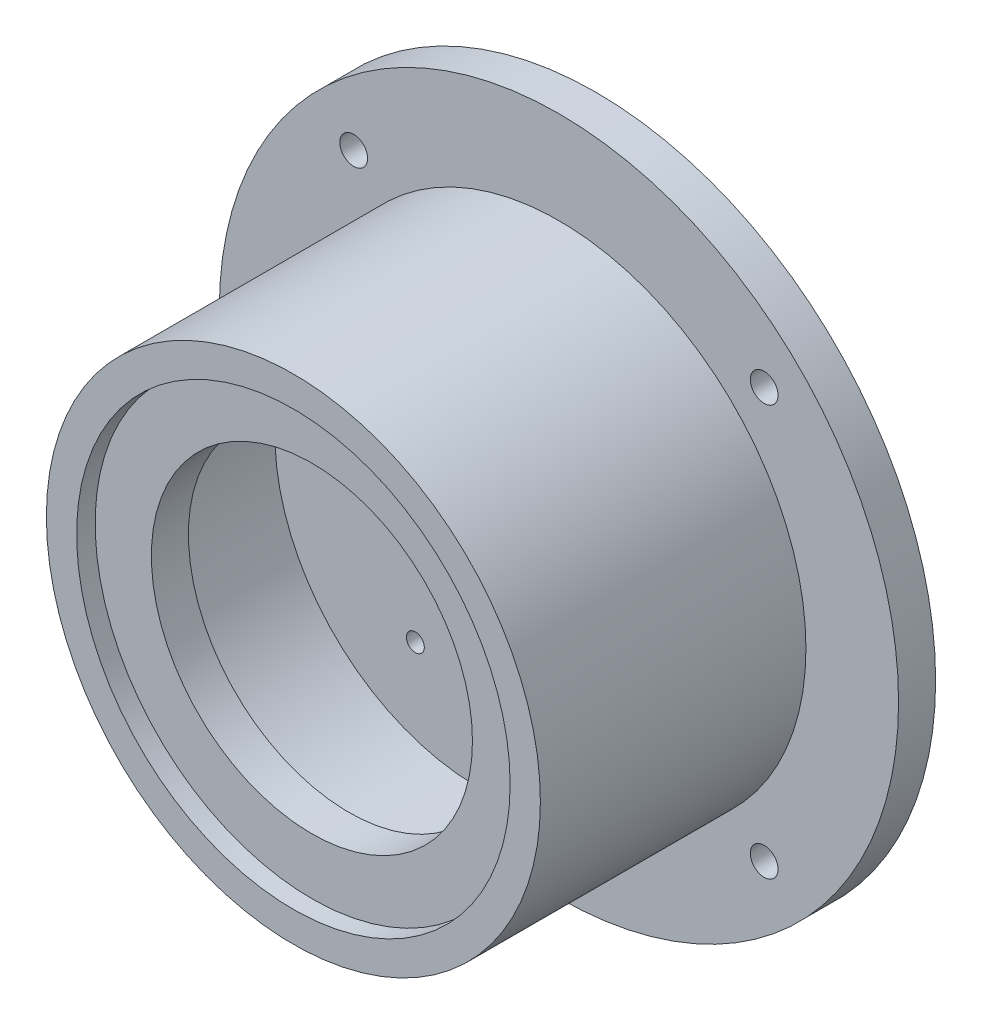
ISO-10303-21;
HEADER;
FILE_DESCRIPTION(('STEP AP214'),'2;1');
FILE_NAME('part.step','',(''),(''),'','','');
FILE_SCHEMA(('AUTOMOTIVE_DESIGN { 1 0 10303 214 1 1 1 1 }'));
ENDSEC;
DATA;
#1=APPLICATION_CONTEXT('core data for automotive mechanical design processes');
#2=APPLICATION_PROTOCOL_DEFINITION('international standard','automotive_design',2000,#1);
#3=PRODUCT_CONTEXT('',#1,'mechanical');
#4=PRODUCT('Part','Part','',(#3));
#5=PRODUCT_RELATED_PRODUCT_CATEGORY('part','',(#4));
#6=PRODUCT_DEFINITION_FORMATION('','',#4);
#7=PRODUCT_DEFINITION_CONTEXT('part definition',#1,'design');
#8=PRODUCT_DEFINITION('design','',#6,#7);
#9=PRODUCT_DEFINITION_SHAPE('','',#8);
#10=(LENGTH_UNIT() NAMED_UNIT(*) SI_UNIT(.MILLI.,.METRE.));
#11=(NAMED_UNIT(*) PLANE_ANGLE_UNIT() SI_UNIT($,.RADIAN.));
#12=(NAMED_UNIT(*) SI_UNIT($,.STERADIAN.) SOLID_ANGLE_UNIT());
#13=UNCERTAINTY_MEASURE_WITH_UNIT(LENGTH_MEASURE(1.E-05),#10,'distance_accuracy_value','');
#14=(GEOMETRIC_REPRESENTATION_CONTEXT(3) GLOBAL_UNCERTAINTY_ASSIGNED_CONTEXT((#13)) GLOBAL_UNIT_ASSIGNED_CONTEXT((#10,
#11,#12)) REPRESENTATION_CONTEXT('',''));
#15=CARTESIAN_POINT('',(0.,0.,0.));
#16=DIRECTION('',(0.,0.,1.));
#17=DIRECTION('',(1.,0.,0.));
#18=AXIS2_PLACEMENT_3D('',#15,#16,#17);
#19=CARTESIAN_POINT('',(0.,0.,16.));
#20=DIRECTION('',(0.,0.,1.));
#21=DIRECTION('',(1.,0.,0.));
#22=AXIS2_PLACEMENT_3D('',#19,#20,#21);
#23=PLANE('',#22);
#24=CARTESIAN_POINT('',(0.,0.,16.));
#25=DIRECTION('',(0.,0.,1.));
#26=DIRECTION('',(1.,0.,0.));
#27=AXIS2_PLACEMENT_3D('',#24,#25,#26);
#28=CIRCLE('',#27,28.);
#29=CARTESIAN_POINT('',(28.,0.,16.));
#30=VERTEX_POINT('',#29);
#31=EDGE_CURVE('E107',#30,#30,#28,.F.);
#32=ORIENTED_EDGE('',*,*,#31,.T.);
#33=EDGE_LOOP('',(#32));
#34=FACE_BOUND('',#33,.T.);
#35=CARTESIAN_POINT('',(0.,0.,16.));
#36=DIRECTION('',(0.,0.,1.));
#37=DIRECTION('',(1.,0.,0.));
#38=AXIS2_PLACEMENT_3D('',#35,#36,#37);
#39=CIRCLE('',#38,33.);
#40=CARTESIAN_POINT('',(33.,0.,16.));
#41=VERTEX_POINT('',#40);
#42=EDGE_CURVE('E67',#41,#41,#39,.T.);
#43=ORIENTED_EDGE('',*,*,#42,.T.);
#44=EDGE_LOOP('',(#43));
#45=FACE_BOUND('',#44,.T.);
#46=ADVANCED_FACE('F41',(#34,#45),#23,.T.);
#47=CARTESIAN_POINT('',(0.,0.,50.));
#48=DIRECTION('',(0.,0.,-1.));
#49=DIRECTION('',(-1.,0.,0.));
#50=AXIS2_PLACEMENT_3D('',#47,#48,#49);
#51=CYLINDRICAL_SURFACE('',#50,33.);
#52=ORIENTED_EDGE('',*,*,#42,.F.);
#53=EDGE_LOOP('',(#52));
#54=FACE_BOUND('',#53,.T.);
#55=CARTESIAN_POINT('',(0.,0.,23.));
#56=DIRECTION('',(0.,0.,1.));
#57=DIRECTION('',(1.,0.,0.));
#58=AXIS2_PLACEMENT_3D('',#55,#56,#57);
#59=CIRCLE('',#58,33.);
#60=CARTESIAN_POINT('',(33.,0.,23.));
#61=VERTEX_POINT('',#60);
#62=EDGE_CURVE('E105',#61,#61,#59,.T.);
#63=ORIENTED_EDGE('',*,*,#62,.T.);
#64=EDGE_LOOP('',(#63));
#65=FACE_BOUND('',#64,.T.);
#66=ADVANCED_FACE('F218',(#54,#65),#51,.F.);
#67=CARTESIAN_POINT('',(0.,0.,23.));
#68=DIRECTION('',(0.,0.,1.));
#69=DIRECTION('',(1.,0.,0.));
#70=AXIS2_PLACEMENT_3D('',#67,#68,#69);
#71=PLANE('',#70);
#72=CARTESIAN_POINT('',(20.5,0.,23.));
#73=DIRECTION('',(0.,0.,1.));
#74=DIRECTION('',(1.,0.,0.));
#75=AXIS2_PLACEMENT_3D('',#72,#73,#74);
#76=CIRCLE('',#75,1.45);
#77=CARTESIAN_POINT('',(21.95,0.,23.));
#78=VERTEX_POINT('',#77);
#79=EDGE_CURVE('E156',#78,#78,#76,.T.);
#80=ORIENTED_EDGE('',*,*,#79,.T.);
#81=EDGE_LOOP('',(#80));
#82=FACE_BOUND('',#81,.T.);
#83=CARTESIAN_POINT('',(10.25,-17.753520777581,23.));
#84=DIRECTION('',(0.,0.,1.));
#85=DIRECTION('',(1.,0.,0.));
#86=AXIS2_PLACEMENT_3D('',#83,#84,#85);
#87=CIRCLE('',#86,1.45);
#88=CARTESIAN_POINT('',(11.7,-17.753520777581,23.));
#89=VERTEX_POINT('',#88);
#90=EDGE_CURVE('E128',#89,#89,#87,.T.);
#91=ORIENTED_EDGE('',*,*,#90,.T.);
#92=EDGE_LOOP('',(#91));
#93=FACE_BOUND('',#92,.T.);
#94=CARTESIAN_POINT('',(-10.25,-17.753520777581,23.));
#95=DIRECTION('',(0.,0.,1.));
#96=DIRECTION('',(1.,0.,0.));
#97=AXIS2_PLACEMENT_3D('',#94,#95,#96);
#98=CIRCLE('',#97,1.45);
#99=CARTESIAN_POINT('',(-8.80000000000001,-17.753520777581,23.));
#100=VERTEX_POINT('',#99);
#101=EDGE_CURVE('E129',#100,#100,#98,.T.);
#102=ORIENTED_EDGE('',*,*,#101,.T.);
#103=EDGE_LOOP('',(#102));
#104=FACE_BOUND('',#103,.T.);
#105=CARTESIAN_POINT('',(-20.5,0.,23.));
#106=DIRECTION('',(0.,0.,1.));
#107=DIRECTION('',(1.,0.,0.));
#108=AXIS2_PLACEMENT_3D('',#105,#106,#107);
#109=CIRCLE('',#108,1.45);
#110=CARTESIAN_POINT('',(-19.05,0.,23.));
#111=VERTEX_POINT('',#110);
#112=EDGE_CURVE('E140',#111,#111,#109,.T.);
#113=ORIENTED_EDGE('',*,*,#112,.T.);
#114=EDGE_LOOP('',(#113));
#115=FACE_BOUND('',#114,.T.);
#116=CARTESIAN_POINT('',(-10.25,17.753520777581,23.));
#117=DIRECTION('',(0.,0.,1.));
#118=DIRECTION('',(1.,0.,0.));
#119=AXIS2_PLACEMENT_3D('',#116,#117,#118);
#120=CIRCLE('',#119,1.45);
#121=CARTESIAN_POINT('',(-8.8,17.753520777581,23.));
#122=VERTEX_POINT('',#121);
#123=EDGE_CURVE('E144',#122,#122,#120,.T.);
#124=ORIENTED_EDGE('',*,*,#123,.T.);
#125=EDGE_LOOP('',(#124));
#126=FACE_BOUND('',#125,.T.);
#127=CARTESIAN_POINT('',(10.25,17.753520777581,23.));
#128=DIRECTION('',(0.,0.,1.));
#129=DIRECTION('',(1.,0.,0.));
#130=AXIS2_PLACEMENT_3D('',#127,#128,#129);
#131=CIRCLE('',#130,1.45);
#132=CARTESIAN_POINT('',(11.7,17.753520777581,23.));
#133=VERTEX_POINT('',#132);
#134=EDGE_CURVE('E155',#133,#133,#131,.T.);
#135=ORIENTED_EDGE('',*,*,#134,.T.);
#136=EDGE_LOOP('',(#135));
#137=FACE_BOUND('',#136,.T.);
#138=CARTESIAN_POINT('',(0.,0.,23.));
#139=DIRECTION('',(0.,0.,1.));
#140=DIRECTION('',(1.,0.,0.));
#141=AXIS2_PLACEMENT_3D('',#138,#139,#140);
#142=CIRCLE('',#141,8.);
#143=CARTESIAN_POINT('',(8.,0.,23.));
#144=VERTEX_POINT('',#143);
#145=EDGE_CURVE('E120',#144,#144,#142,.T.);
#146=ORIENTED_EDGE('',*,*,#145,.T.);
#147=EDGE_LOOP('',(#146));
#148=FACE_BOUND('',#147,.T.);
#149=ORIENTED_EDGE('',*,*,#62,.F.);
#150=EDGE_LOOP('',(#149));
#151=FACE_BOUND('',#150,.T.);
#152=ADVANCED_FACE('F223',(#82,#93,#104,#115,#126,#137,#148,#151),#71,.F.);
#153=CARTESIAN_POINT('',(0.,0.,23.));
#154=DIRECTION('',(0.,0.,-1.));
#155=DIRECTION('',(-1.,0.,0.));
#156=AXIS2_PLACEMENT_3D('',#153,#154,#155);
#157=CYLINDRICAL_SURFACE('',#156,28.);
#158=ORIENTED_EDGE('',*,*,#31,.F.);
#159=EDGE_LOOP('',(#158));
#160=FACE_BOUND('',#159,.T.);
#161=CARTESIAN_POINT('',(0.,0.,10.));
#162=DIRECTION('',(0.,0.,1.));
#163=DIRECTION('',(1.,0.,0.));
#164=AXIS2_PLACEMENT_3D('',#161,#162,#163);
#165=CIRCLE('',#164,28.);
#166=CARTESIAN_POINT('',(28.,0.,10.));
#167=VERTEX_POINT('',#166);
#168=EDGE_CURVE('E115',#167,#167,#165,.T.);
#169=ORIENTED_EDGE('',*,*,#168,.F.);
#170=EDGE_LOOP('',(#169));
#171=FACE_BOUND('',#170,.T.);
#172=ADVANCED_FACE('F260',(#160,#171),#157,.F.);
#173=CARTESIAN_POINT('',(0.,0.,56.));
#174=DIRECTION('',(0.,0.,1.));
#175=DIRECTION('',(1.,0.,0.));
#176=AXIS2_PLACEMENT_3D('',#173,#174,#175);
#177=PLANE('',#176);
#178=CARTESIAN_POINT('',(0.,0.,56.));
#179=DIRECTION('',(0.,0.,1.));
#180=DIRECTION('',(1.,0.,0.));
#181=AXIS2_PLACEMENT_3D('',#178,#179,#180);
#182=CIRCLE('',#181,26.);
#183=CARTESIAN_POINT('',(26.,0.,56.));
#184=VERTEX_POINT('',#183);
#185=EDGE_CURVE('E84',#184,#184,#182,.T.);
#186=ORIENTED_EDGE('',*,*,#185,.F.);
#187=EDGE_LOOP('',(#186));
#188=FACE_BOUND('',#187,.T.);
#189=CARTESIAN_POINT('',(0.,0.,56.));
#190=DIRECTION('',(0.,0.,1.));
#191=DIRECTION('',(1.,0.,0.));
#192=AXIS2_PLACEMENT_3D('',#189,#190,#191);
#193=CIRCLE('',#192,35.1);
#194=CARTESIAN_POINT('',(35.1,0.,56.));
#195=VERTEX_POINT('',#194);
#196=EDGE_CURVE('E97',#195,#195,#193,.T.);
#197=ORIENTED_EDGE('',*,*,#196,.T.);
#198=EDGE_LOOP('',(#197));
#199=FACE_BOUND('',#198,.T.);
#200=ADVANCED_FACE('F259',(#188,#199),#177,.T.);
#201=CARTESIAN_POINT('',(0.,0.,50.));
#202=DIRECTION('',(0.,0.,1.));
#203=DIRECTION('',(1.,0.,0.));
#204=AXIS2_PLACEMENT_3D('',#201,#202,#203);
#205=PLANE('',#204);
#206=CARTESIAN_POINT('',(0.,0.,50.));
#207=DIRECTION('',(0.,0.,1.));
#208=DIRECTION('',(1.,0.,0.));
#209=AXIS2_PLACEMENT_3D('',#206,#207,#208);
#210=CIRCLE('',#209,26.);
#211=CARTESIAN_POINT('',(26.,0.,50.));
#212=VERTEX_POINT('',#211);
#213=EDGE_CURVE('E86',#212,#212,#210,.T.);
#214=ORIENTED_EDGE('',*,*,#213,.T.);
#215=EDGE_LOOP('',(#214));
#216=FACE_BOUND('',#215,.T.);
#217=CARTESIAN_POINT('',(0.,0.,50.));
#218=DIRECTION('',(0.,0.,1.));
#219=DIRECTION('',(1.,0.,0.));
#220=AXIS2_PLACEMENT_3D('',#217,#218,#219);
#221=CIRCLE('',#220,33.);
#222=CARTESIAN_POINT('',(33.,0.,50.));
#223=VERTEX_POINT('',#222);
#224=EDGE_CURVE('E78',#223,#223,#221,.T.);
#225=ORIENTED_EDGE('',*,*,#224,.F.);
#226=EDGE_LOOP('',(#225));
#227=FACE_BOUND('',#226,.T.);
#228=ADVANCED_FACE('F264',(#216,#227),#205,.F.);
#229=CARTESIAN_POINT('',(0.,0.,56.));
#230=DIRECTION('',(0.,0.,-1.));
#231=DIRECTION('',(-1.,0.,0.));
#232=AXIS2_PLACEMENT_3D('',#229,#230,#231);
#233=CYLINDRICAL_SURFACE('',#232,26.);
#234=ORIENTED_EDGE('',*,*,#185,.T.);
#235=EDGE_LOOP('',(#234));
#236=FACE_BOUND('',#235,.T.);
#237=ORIENTED_EDGE('',*,*,#213,.F.);
#238=EDGE_LOOP('',(#237));
#239=FACE_BOUND('',#238,.T.);
#240=ADVANCED_FACE('F284',(#236,#239),#233,.F.);
#241=CARTESIAN_POINT('',(0.,0.,29.));
#242=DIRECTION('',(0.,0.,1.));
#243=DIRECTION('',(1.,0.,0.));
#244=AXIS2_PLACEMENT_3D('',#241,#242,#243);
#245=CIRCLE('',#244,33.);
#246=CARTESIAN_POINT('',(33.,0.,29.));
#247=VERTEX_POINT('',#246);
#248=EDGE_CURVE('E10',#247,#247,#245,.T.);
#249=ORIENTED_EDGE('',*,*,#248,.F.);
#250=EDGE_LOOP('',(#249));
#251=FACE_BOUND('',#250,.T.);
#252=ORIENTED_EDGE('',*,*,#224,.T.);
#253=EDGE_LOOP('',(#252));
#254=FACE_BOUND('',#253,.T.);
#255=ADVANCED_FACE('F226',(#251,#254),#51,.F.);
#256=CARTESIAN_POINT('',(0.,0.,59.));
#257=DIRECTION('',(0.,0.,1.));
#258=DIRECTION('',(1.,0.,0.));
#259=AXIS2_PLACEMENT_3D('',#256,#257,#258);
#260=PLANE('',#259);
#261=CARTESIAN_POINT('',(0.,0.,59.));
#262=DIRECTION('',(0.,0.,1.));
#263=DIRECTION('',(1.,0.,0.));
#264=AXIS2_PLACEMENT_3D('',#261,#262,#263);
#265=CIRCLE('',#264,40.);
#266=CARTESIAN_POINT('',(40.,0.,59.));
#267=VERTEX_POINT('',#266);
#268=EDGE_CURVE('E91',#267,#267,#265,.T.);
#269=ORIENTED_EDGE('',*,*,#268,.T.);
#270=EDGE_LOOP('',(#269));
#271=FACE_BOUND('',#270,.T.);
#272=CARTESIAN_POINT('',(0.,0.,59.));
#273=DIRECTION('',(0.,0.,1.));
#274=DIRECTION('',(1.,0.,0.));
#275=AXIS2_PLACEMENT_3D('',#272,#273,#274);
#276=CIRCLE('',#275,35.1);
#277=CARTESIAN_POINT('',(35.1,0.,59.));
#278=VERTEX_POINT('',#277);
#279=EDGE_CURVE('E98',#278,#278,#276,.T.);
#280=ORIENTED_EDGE('',*,*,#279,.F.);
#281=EDGE_LOOP('',(#280));
#282=FACE_BOUND('',#281,.T.);
#283=ADVANCED_FACE('F278',(#271,#282),#260,.T.);
#284=CARTESIAN_POINT('',(0.,0.,59.));
#285=DIRECTION('',(0.,0.,-1.));
#286=DIRECTION('',(-1.,0.,0.));
#287=AXIS2_PLACEMENT_3D('',#284,#285,#286);
#288=CYLINDRICAL_SURFACE('',#287,35.1);
#289=ORIENTED_EDGE('',*,*,#279,.T.);
#290=EDGE_LOOP('',(#289));
#291=FACE_BOUND('',#290,.T.);
#292=ORIENTED_EDGE('',*,*,#196,.F.);
#293=EDGE_LOOP('',(#292));
#294=FACE_BOUND('',#293,.T.);
#295=ADVANCED_FACE('F252',(#291,#294),#288,.F.);
#296=CARTESIAN_POINT('',(0.,0.,10.));
#297=DIRECTION('',(0.,0.,1.));
#298=DIRECTION('',(1.,0.,0.));
#299=AXIS2_PLACEMENT_3D('',#296,#297,#298);
#300=PLANE('',#299);
#301=CARTESIAN_POINT('',(33.2340187157677,-33.2340187157677,10.));
#302=DIRECTION('',(0.,0.,1.));
#303=DIRECTION('',(1.,0.,0.));
#304=AXIS2_PLACEMENT_3D('',#301,#302,#303);
#305=CIRCLE('',#304,2.25);
#306=CARTESIAN_POINT('',(35.4840187157677,-33.2340187157677,10.));
#307=VERTEX_POINT('',#306);
#308=EDGE_CURVE('E182',#307,#307,#305,.T.);
#309=ORIENTED_EDGE('',*,*,#308,.T.);
#310=EDGE_LOOP('',(#309));
#311=FACE_BOUND('',#310,.T.);
#312=CARTESIAN_POINT('',(-33.2340187157677,-33.2340187157677,10.));
#313=DIRECTION('',(0.,0.,1.));
#314=DIRECTION('',(1.,0.,0.));
#315=AXIS2_PLACEMENT_3D('',#312,#313,#314);
#316=CIRCLE('',#315,2.25);
#317=CARTESIAN_POINT('',(-30.9840187157677,-33.2340187157677,10.));
#318=VERTEX_POINT('',#317);
#319=EDGE_CURVE('E187',#318,#318,#316,.T.);
#320=ORIENTED_EDGE('',*,*,#319,.T.);
#321=EDGE_LOOP('',(#320));
#322=FACE_BOUND('',#321,.T.);
#323=CARTESIAN_POINT('',(-33.2340187157677,33.2340187157677,10.));
#324=DIRECTION('',(0.,0.,1.));
#325=DIRECTION('',(1.,0.,0.));
#326=AXIS2_PLACEMENT_3D('',#323,#324,#325);
#327=CIRCLE('',#326,2.25);
#328=CARTESIAN_POINT('',(-30.9840187157677,33.2340187157677,10.));
#329=VERTEX_POINT('',#328);
#330=EDGE_CURVE('E172',#329,#329,#327,.T.);
#331=ORIENTED_EDGE('',*,*,#330,.T.);
#332=EDGE_LOOP('',(#331));
#333=FACE_BOUND('',#332,.T.);
#334=CARTESIAN_POINT('',(33.2340187157677,33.2340187157677,10.));
#335=DIRECTION('',(0.,0.,1.));
#336=DIRECTION('',(1.,0.,0.));
#337=AXIS2_PLACEMENT_3D('',#334,#335,#336);
#338=CIRCLE('',#337,2.25);
#339=CARTESIAN_POINT('',(35.4840187157677,33.2340187157677,10.));
#340=VERTEX_POINT('',#339);
#341=EDGE_CURVE('E173',#340,#340,#338,.T.);
#342=ORIENTED_EDGE('',*,*,#341,.T.);
#343=EDGE_LOOP('',(#342));
#344=FACE_BOUND('',#343,.T.);
#345=ORIENTED_EDGE('',*,*,#168,.T.);
#346=EDGE_LOOP('',(#345));
#347=FACE_BOUND('',#346,.T.);
#348=CARTESIAN_POINT('',(0.,0.,10.));
#349=DIRECTION('',(0.,0.,1.));
#350=DIRECTION('',(1.,0.,0.));
#351=AXIS2_PLACEMENT_3D('',#348,#349,#350);
#352=CIRCLE('',#351,55.);
#353=CARTESIAN_POINT('',(55.,0.,10.));
#354=VERTEX_POINT('',#353);
#355=EDGE_CURVE('E61',#354,#354,#352,.T.);
#356=ORIENTED_EDGE('',*,*,#355,.F.);
#357=EDGE_LOOP('',(#356));
#358=FACE_BOUND('',#357,.T.);
#359=ADVANCED_FACE('F199',(#311,#322,#333,#344,#347,#358),#300,.F.);
#360=CARTESIAN_POINT('',(0.,0.,16.));
#361=DIRECTION('',(0.,0.,-1.));
#362=DIRECTION('',(-1.,0.,0.));
#363=AXIS2_PLACEMENT_3D('',#360,#361,#362);
#364=CYLINDRICAL_SURFACE('',#363,55.);
#365=CARTESIAN_POINT('',(0.,0.,16.));
#366=DIRECTION('',(0.,0.,1.));
#367=DIRECTION('',(1.,0.,0.));
#368=AXIS2_PLACEMENT_3D('',#365,#366,#367);
#369=CIRCLE('',#368,55.);
#370=CARTESIAN_POINT('',(55.,0.,16.));
#371=VERTEX_POINT('',#370);
#372=EDGE_CURVE('E57',#371,#371,#369,.T.);
#373=ORIENTED_EDGE('',*,*,#372,.F.);
#374=EDGE_LOOP('',(#373));
#375=FACE_BOUND('',#374,.T.);
#376=ORIENTED_EDGE('',*,*,#355,.T.);
#377=EDGE_LOOP('',(#376));
#378=FACE_BOUND('',#377,.T.);
#379=ADVANCED_FACE('F43',(#375,#378),#364,.T.);
#380=CARTESIAN_POINT('',(33.2340187157677,-33.2340187157677,16.));
#381=DIRECTION('',(0.,0.,1.));
#382=DIRECTION('',(1.,0.,0.));
#383=AXIS2_PLACEMENT_3D('',#380,#381,#382);
#384=CIRCLE('',#383,2.25);
#385=CARTESIAN_POINT('',(35.4840187157677,-33.2340187157677,16.));
#386=VERTEX_POINT('',#385);
#387=EDGE_CURVE('E179',#386,#386,#384,.T.);
#388=ORIENTED_EDGE('',*,*,#387,.F.);
#389=EDGE_LOOP('',(#388));
#390=FACE_BOUND('',#389,.T.);
#391=CARTESIAN_POINT('',(-33.2340187157677,-33.2340187157677,16.));
#392=DIRECTION('',(0.,0.,1.));
#393=DIRECTION('',(1.,0.,0.));
#394=AXIS2_PLACEMENT_3D('',#391,#392,#393);
#395=CIRCLE('',#394,2.25);
#396=CARTESIAN_POINT('',(-30.9840187157677,-33.2340187157677,16.));
#397=VERTEX_POINT('',#396);
#398=EDGE_CURVE('E183',#397,#397,#395,.T.);
#399=ORIENTED_EDGE('',*,*,#398,.F.);
#400=EDGE_LOOP('',(#399));
#401=FACE_BOUND('',#400,.T.);
#402=CARTESIAN_POINT('',(-33.2340187157677,33.2340187157677,16.));
#403=DIRECTION('',(0.,0.,1.));
#404=DIRECTION('',(1.,0.,0.));
#405=AXIS2_PLACEMENT_3D('',#402,#403,#404);
#406=CIRCLE('',#405,2.25);
#407=CARTESIAN_POINT('',(-30.9840187157677,33.2340187157677,16.));
#408=VERTEX_POINT('',#407);
#409=EDGE_CURVE('E195',#408,#408,#406,.T.);
#410=ORIENTED_EDGE('',*,*,#409,.F.);
#411=EDGE_LOOP('',(#410));
#412=FACE_BOUND('',#411,.T.);
#413=CARTESIAN_POINT('',(33.2340187157677,33.2340187157677,16.));
#414=DIRECTION('',(0.,0.,1.));
#415=DIRECTION('',(1.,0.,0.));
#416=AXIS2_PLACEMENT_3D('',#413,#414,#415);
#417=CIRCLE('',#416,2.25);
#418=CARTESIAN_POINT('',(35.4840187157677,33.2340187157677,16.));
#419=VERTEX_POINT('',#418);
#420=EDGE_CURVE('E161',#419,#419,#417,.T.);
#421=ORIENTED_EDGE('',*,*,#420,.F.);
#422=EDGE_LOOP('',(#421));
#423=FACE_BOUND('',#422,.T.);
#424=CARTESIAN_POINT('',(0.,0.,16.));
#425=DIRECTION('',(0.,0.,1.));
#426=DIRECTION('',(1.,0.,0.));
#427=AXIS2_PLACEMENT_3D('',#424,#425,#426);
#428=CIRCLE('',#427,40.);
#429=CARTESIAN_POINT('',(40.,0.,16.));
#430=VERTEX_POINT('',#429);
#431=EDGE_CURVE('E47',#430,#430,#428,.T.);
#432=ORIENTED_EDGE('',*,*,#431,.F.);
#433=EDGE_LOOP('',(#432));
#434=FACE_BOUND('',#433,.T.);
#435=ORIENTED_EDGE('',*,*,#372,.T.);
#436=EDGE_LOOP('',(#435));
#437=FACE_BOUND('',#436,.T.);
#438=ADVANCED_FACE('F225',(#390,#401,#412,#423,#434,#437),#23,.T.);
#439=CARTESIAN_POINT('',(0.,0.,50.));
#440=DIRECTION('',(0.,0.,-1.));
#441=DIRECTION('',(-1.,0.,0.));
#442=AXIS2_PLACEMENT_3D('',#439,#440,#441);
#443=CYLINDRICAL_SURFACE('',#442,40.);
#444=ORIENTED_EDGE('',*,*,#431,.T.);
#445=EDGE_LOOP('',(#444));
#446=FACE_BOUND('',#445,.T.);
#447=ORIENTED_EDGE('',*,*,#268,.F.);
#448=EDGE_LOOP('',(#447));
#449=FACE_BOUND('',#448,.T.);
#450=ADVANCED_FACE('F232',(#446,#449),#443,.T.);
#451=CARTESIAN_POINT('',(0.,0.,29.));
#452=DIRECTION('',(0.,0.,1.));
#453=DIRECTION('',(1.,0.,0.));
#454=AXIS2_PLACEMENT_3D('',#451,#452,#453);
#455=PLANE('',#454);
#456=CARTESIAN_POINT('',(20.5,0.,29.));
#457=DIRECTION('',(0.,0.,1.));
#458=DIRECTION('',(1.,0.,0.));
#459=AXIS2_PLACEMENT_3D('',#456,#457,#458);
#460=CIRCLE('',#459,1.45);
#461=CARTESIAN_POINT('',(21.95,0.,29.));
#462=VERTEX_POINT('',#461);
#463=EDGE_CURVE('E122',#462,#462,#460,.T.);
#464=ORIENTED_EDGE('',*,*,#463,.F.);
#465=EDGE_LOOP('',(#464));
#466=FACE_BOUND('',#465,.T.);
#467=CARTESIAN_POINT('',(10.25,-17.753520777581,29.));
#468=DIRECTION('',(0.,0.,1.));
#469=DIRECTION('',(1.,0.,0.));
#470=AXIS2_PLACEMENT_3D('',#467,#468,#469);
#471=CIRCLE('',#470,1.45);
#472=CARTESIAN_POINT('',(11.7,-17.753520777581,29.));
#473=VERTEX_POINT('',#472);
#474=EDGE_CURVE('E160',#473,#473,#471,.T.);
#475=ORIENTED_EDGE('',*,*,#474,.F.);
#476=EDGE_LOOP('',(#475));
#477=FACE_BOUND('',#476,.T.);
#478=CARTESIAN_POINT('',(-10.25,-17.753520777581,29.));
#479=DIRECTION('',(0.,0.,1.));
#480=DIRECTION('',(1.,0.,0.));
#481=AXIS2_PLACEMENT_3D('',#478,#479,#480);
#482=CIRCLE('',#481,1.45);
#483=CARTESIAN_POINT('',(-8.80000000000001,-17.753520777581,29.));
#484=VERTEX_POINT('',#483);
#485=EDGE_CURVE('E123',#484,#484,#482,.T.);
#486=ORIENTED_EDGE('',*,*,#485,.F.);
#487=EDGE_LOOP('',(#486));
#488=FACE_BOUND('',#487,.T.);
#489=CARTESIAN_POINT('',(-20.5,0.,29.));
#490=DIRECTION('',(0.,0.,1.));
#491=DIRECTION('',(1.,0.,0.));
#492=AXIS2_PLACEMENT_3D('',#489,#490,#491);
#493=CIRCLE('',#492,1.45);
#494=CARTESIAN_POINT('',(-19.05,0.,29.));
#495=VERTEX_POINT('',#494);
#496=EDGE_CURVE('E132',#495,#495,#493,.T.);
#497=ORIENTED_EDGE('',*,*,#496,.F.);
#498=EDGE_LOOP('',(#497));
#499=FACE_BOUND('',#498,.T.);
#500=CARTESIAN_POINT('',(-10.25,17.753520777581,29.));
#501=DIRECTION('',(0.,0.,1.));
#502=DIRECTION('',(1.,0.,0.));
#503=AXIS2_PLACEMENT_3D('',#500,#501,#502);
#504=CIRCLE('',#503,1.45);
#505=CARTESIAN_POINT('',(-8.8,17.753520777581,29.));
#506=VERTEX_POINT('',#505);
#507=EDGE_CURVE('E143',#506,#506,#504,.T.);
#508=ORIENTED_EDGE('',*,*,#507,.F.);
#509=EDGE_LOOP('',(#508));
#510=FACE_BOUND('',#509,.T.);
#511=CARTESIAN_POINT('',(10.25,17.753520777581,29.));
#512=DIRECTION('',(0.,0.,1.));
#513=DIRECTION('',(1.,0.,0.));
#514=AXIS2_PLACEMENT_3D('',#511,#512,#513);
#515=CIRCLE('',#514,1.45);
#516=CARTESIAN_POINT('',(11.7,17.753520777581,29.));
#517=VERTEX_POINT('',#516);
#518=EDGE_CURVE('E149',#517,#517,#515,.T.);
#519=ORIENTED_EDGE('',*,*,#518,.F.);
#520=EDGE_LOOP('',(#519));
#521=FACE_BOUND('',#520,.T.);
#522=CARTESIAN_POINT('',(0.,0.,29.));
#523=DIRECTION('',(0.,0.,1.));
#524=DIRECTION('',(1.,0.,0.));
#525=AXIS2_PLACEMENT_3D('',#522,#523,#524);
#526=CIRCLE('',#525,8.);
#527=CARTESIAN_POINT('',(8.,0.,29.));
#528=VERTEX_POINT('',#527);
#529=EDGE_CURVE('E118',#528,#528,#526,.T.);
#530=ORIENTED_EDGE('',*,*,#529,.F.);
#531=EDGE_LOOP('',(#530));
#532=FACE_BOUND('',#531,.T.);
#533=ORIENTED_EDGE('',*,*,#248,.T.);
#534=EDGE_LOOP('',(#533));
#535=FACE_BOUND('',#534,.T.);
#536=ADVANCED_FACE('F237',(#466,#477,#488,#499,#510,#521,#532,#535),#455,.T.);
#537=CARTESIAN_POINT('',(0.,0.,29.));
#538=DIRECTION('',(0.,0.,-1.));
#539=DIRECTION('',(-1.,0.,0.));
#540=AXIS2_PLACEMENT_3D('',#537,#538,#539);
#541=CYLINDRICAL_SURFACE('',#540,8.);
#542=ORIENTED_EDGE('',*,*,#529,.T.);
#543=EDGE_LOOP('',(#542));
#544=FACE_BOUND('',#543,.T.);
#545=ORIENTED_EDGE('',*,*,#145,.F.);
#546=EDGE_LOOP('',(#545));
#547=FACE_BOUND('',#546,.T.);
#548=ADVANCED_FACE('F272',(#544,#547),#541,.F.);
#549=CARTESIAN_POINT('',(10.25,17.753520777581,29.));
#550=DIRECTION('',(0.,0.,-1.));
#551=DIRECTION('',(-1.,0.,0.));
#552=AXIS2_PLACEMENT_3D('',#549,#550,#551);
#553=CYLINDRICAL_SURFACE('',#552,1.45);
#554=ORIENTED_EDGE('',*,*,#518,.T.);
#555=EDGE_LOOP('',(#554));
#556=FACE_BOUND('',#555,.T.);
#557=ORIENTED_EDGE('',*,*,#134,.F.);
#558=EDGE_LOOP('',(#557));
#559=FACE_BOUND('',#558,.T.);
#560=ADVANCED_FACE('F373',(#556,#559),#553,.F.);
#561=CARTESIAN_POINT('',(-10.25,17.753520777581,29.));
#562=DIRECTION('',(0.,0.,-1.));
#563=DIRECTION('',(-1.,0.,0.));
#564=AXIS2_PLACEMENT_3D('',#561,#562,#563);
#565=CYLINDRICAL_SURFACE('',#564,1.45);
#566=ORIENTED_EDGE('',*,*,#507,.T.);
#567=EDGE_LOOP('',(#566));
#568=FACE_BOUND('',#567,.T.);
#569=ORIENTED_EDGE('',*,*,#123,.F.);
#570=EDGE_LOOP('',(#569));
#571=FACE_BOUND('',#570,.T.);
#572=ADVANCED_FACE('F385',(#568,#571),#565,.F.);
#573=CARTESIAN_POINT('',(-20.5,0.,29.));
#574=DIRECTION('',(0.,0.,-1.));
#575=DIRECTION('',(-1.,0.,0.));
#576=AXIS2_PLACEMENT_3D('',#573,#574,#575);
#577=CYLINDRICAL_SURFACE('',#576,1.45);
#578=ORIENTED_EDGE('',*,*,#496,.T.);
#579=EDGE_LOOP('',(#578));
#580=FACE_BOUND('',#579,.T.);
#581=ORIENTED_EDGE('',*,*,#112,.F.);
#582=EDGE_LOOP('',(#581));
#583=FACE_BOUND('',#582,.T.);
#584=ADVANCED_FACE('F395',(#580,#583),#577,.F.);
#585=CARTESIAN_POINT('',(-10.25,-17.753520777581,29.));
#586=DIRECTION('',(0.,0.,-1.));
#587=DIRECTION('',(-1.,0.,0.));
#588=AXIS2_PLACEMENT_3D('',#585,#586,#587);
#589=CYLINDRICAL_SURFACE('',#588,1.45);
#590=ORIENTED_EDGE('',*,*,#485,.T.);
#591=EDGE_LOOP('',(#590));
#592=FACE_BOUND('',#591,.T.);
#593=ORIENTED_EDGE('',*,*,#101,.F.);
#594=EDGE_LOOP('',(#593));
#595=FACE_BOUND('',#594,.T.);
#596=ADVANCED_FACE('F405',(#592,#595),#589,.F.);
#597=CARTESIAN_POINT('',(10.25,-17.753520777581,29.));
#598=DIRECTION('',(0.,0.,-1.));
#599=DIRECTION('',(-1.,0.,0.));
#600=AXIS2_PLACEMENT_3D('',#597,#598,#599);
#601=CYLINDRICAL_SURFACE('',#600,1.45);
#602=ORIENTED_EDGE('',*,*,#474,.T.);
#603=EDGE_LOOP('',(#602));
#604=FACE_BOUND('',#603,.T.);
#605=ORIENTED_EDGE('',*,*,#90,.F.);
#606=EDGE_LOOP('',(#605));
#607=FACE_BOUND('',#606,.T.);
#608=ADVANCED_FACE('F414',(#604,#607),#601,.F.);
#609=CARTESIAN_POINT('',(20.5,0.,29.));
#610=DIRECTION('',(0.,0.,-1.));
#611=DIRECTION('',(-1.,0.,0.));
#612=AXIS2_PLACEMENT_3D('',#609,#610,#611);
#613=CYLINDRICAL_SURFACE('',#612,1.45);
#614=ORIENTED_EDGE('',*,*,#463,.T.);
#615=EDGE_LOOP('',(#614));
#616=FACE_BOUND('',#615,.T.);
#617=ORIENTED_EDGE('',*,*,#79,.F.);
#618=EDGE_LOOP('',(#617));
#619=FACE_BOUND('',#618,.T.);
#620=ADVANCED_FACE('F214',(#616,#619),#613,.F.);
#621=CARTESIAN_POINT('',(33.2340187157677,33.2340187157677,16.));
#622=DIRECTION('',(0.,0.,-1.));
#623=DIRECTION('',(-1.,0.,0.));
#624=AXIS2_PLACEMENT_3D('',#621,#622,#623);
#625=CYLINDRICAL_SURFACE('',#624,2.25);
#626=ORIENTED_EDGE('',*,*,#420,.T.);
#627=EDGE_LOOP('',(#626));
#628=FACE_BOUND('',#627,.T.);
#629=ORIENTED_EDGE('',*,*,#341,.F.);
#630=EDGE_LOOP('',(#629));
#631=FACE_BOUND('',#630,.T.);
#632=ADVANCED_FACE('F206',(#628,#631),#625,.F.);
#633=CARTESIAN_POINT('',(-33.2340187157677,33.2340187157677,16.));
#634=DIRECTION('',(0.,0.,-1.));
#635=DIRECTION('',(-1.,0.,0.));
#636=AXIS2_PLACEMENT_3D('',#633,#634,#635);
#637=CYLINDRICAL_SURFACE('',#636,2.25);
#638=ORIENTED_EDGE('',*,*,#409,.T.);
#639=EDGE_LOOP('',(#638));
#640=FACE_BOUND('',#639,.T.);
#641=ORIENTED_EDGE('',*,*,#330,.F.);
#642=EDGE_LOOP('',(#641));
#643=FACE_BOUND('',#642,.T.);
#644=ADVANCED_FACE('F201',(#640,#643),#637,.F.);
#645=CARTESIAN_POINT('',(-33.2340187157677,-33.2340187157677,16.));
#646=DIRECTION('',(0.,0.,-1.));
#647=DIRECTION('',(-1.,0.,0.));
#648=AXIS2_PLACEMENT_3D('',#645,#646,#647);
#649=CYLINDRICAL_SURFACE('',#648,2.25);
#650=ORIENTED_EDGE('',*,*,#398,.T.);
#651=EDGE_LOOP('',(#650));
#652=FACE_BOUND('',#651,.T.);
#653=ORIENTED_EDGE('',*,*,#319,.F.);
#654=EDGE_LOOP('',(#653));
#655=FACE_BOUND('',#654,.T.);
#656=ADVANCED_FACE('F202',(#652,#655),#649,.F.);
#657=CARTESIAN_POINT('',(33.2340187157677,-33.2340187157677,16.));
#658=DIRECTION('',(0.,0.,-1.));
#659=DIRECTION('',(-1.,0.,0.));
#660=AXIS2_PLACEMENT_3D('',#657,#658,#659);
#661=CYLINDRICAL_SURFACE('',#660,2.25);
#662=ORIENTED_EDGE('',*,*,#387,.T.);
#663=EDGE_LOOP('',(#662));
#664=FACE_BOUND('',#663,.T.);
#665=ORIENTED_EDGE('',*,*,#308,.F.);
#666=EDGE_LOOP('',(#665));
#667=FACE_BOUND('',#666,.T.);
#668=ADVANCED_FACE('F215',(#664,#667),#661,.F.);
#669=CLOSED_SHELL('',(#46,#66,#152,#172,#200,#228,#240,#255,#283,#295,#359,#379,#438,#450,#536,
#548,#560,#572,#584,#596,#608,#620,#632,#644,#656,#668));
#670=MANIFOLD_SOLID_BREP('B2',#669);
#671=ADVANCED_BREP_SHAPE_REPRESENTATION('',(#18,#670),#14);
#672=SHAPE_DEFINITION_REPRESENTATION(#9,#671);
ENDSEC;
END-ISO-10303-21;
